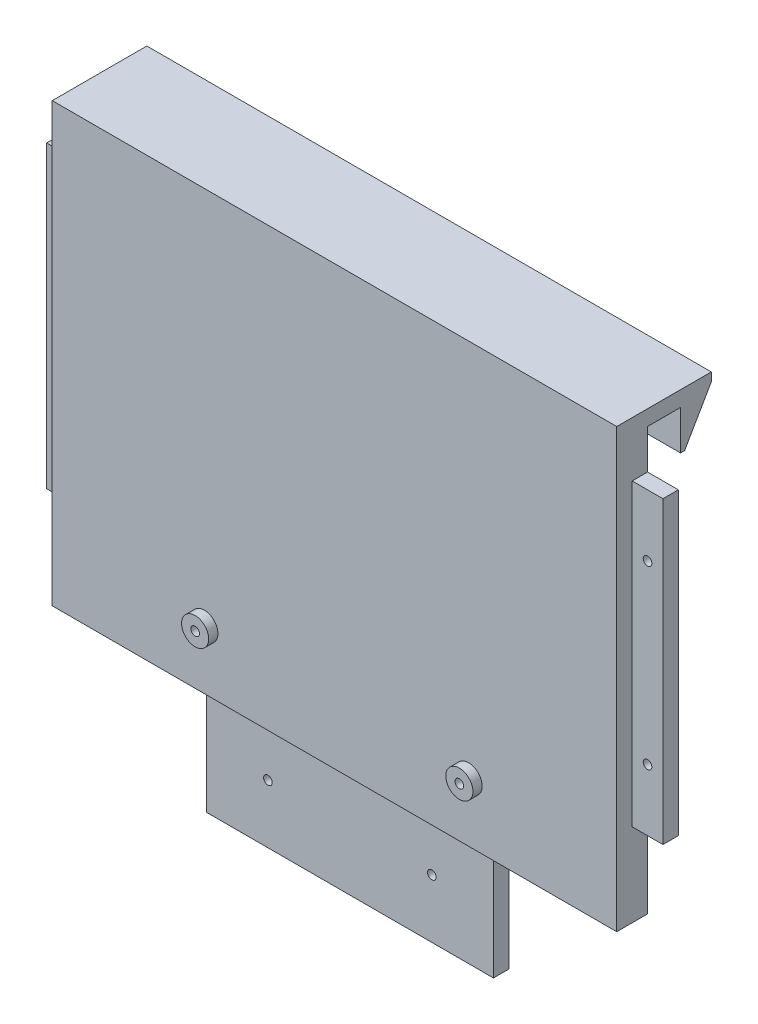
ISO-10303-21;
HEADER;
FILE_DESCRIPTION(('STEP AP214'),'2;1');
FILE_NAME('part.step','',(''),(''),'','','');
FILE_SCHEMA(('AUTOMOTIVE_DESIGN { 1 0 10303 214 1 1 1 1 }'));
ENDSEC;
DATA;
#1=APPLICATION_CONTEXT('core data for automotive mechanical design processes');
#2=APPLICATION_PROTOCOL_DEFINITION('international standard','automotive_design',2000,#1);
#3=PRODUCT_CONTEXT('',#1,'mechanical');
#4=PRODUCT('Part','Part','',(#3));
#5=PRODUCT_RELATED_PRODUCT_CATEGORY('part','',(#4));
#6=PRODUCT_DEFINITION_FORMATION('','',#4);
#7=PRODUCT_DEFINITION_CONTEXT('part definition',#1,'design');
#8=PRODUCT_DEFINITION('design','',#6,#7);
#9=PRODUCT_DEFINITION_SHAPE('','',#8);
#10=(LENGTH_UNIT() NAMED_UNIT(*) SI_UNIT(.MILLI.,.METRE.));
#11=(NAMED_UNIT(*) PLANE_ANGLE_UNIT() SI_UNIT($,.RADIAN.));
#12=(NAMED_UNIT(*) SI_UNIT($,.STERADIAN.) SOLID_ANGLE_UNIT());
#13=UNCERTAINTY_MEASURE_WITH_UNIT(LENGTH_MEASURE(1.E-05),#10,'distance_accuracy_value','');
#14=(GEOMETRIC_REPRESENTATION_CONTEXT(3) GLOBAL_UNCERTAINTY_ASSIGNED_CONTEXT((#13)) GLOBAL_UNIT_ASSIGNED_CONTEXT((#10,
#11,#12)) REPRESENTATION_CONTEXT('',''));
#15=CARTESIAN_POINT('',(0.,0.,0.));
#16=DIRECTION('',(0.,0.,1.));
#17=DIRECTION('',(1.,0.,0.));
#18=AXIS2_PLACEMENT_3D('',#15,#16,#17);
#19=CARTESIAN_POINT('',(0.,0.,30.7));
#20=DIRECTION('',(0.,1.,0.));
#21=DIRECTION('',(0.,0.,1.));
#22=AXIS2_PLACEMENT_3D('',#19,#20,#21);
#23=PLANE('',#22);
#24=DIRECTION('',(1.,0.,0.));
#25=VECTOR('',#24,1.);
#26=CARTESIAN_POINT('',(145.,0.,25.7));
#27=LINE('',#26,#25);
#28=CARTESIAN_POINT('',(51.8000000000001,0.,25.7));
#29=VERTEX_POINT('',#28);
#30=CARTESIAN_POINT('',(145.,0.,25.7));
#31=VERTEX_POINT('',#30);
#32=EDGE_CURVE('E363',#29,#31,#27,.T.);
#33=ORIENTED_EDGE('',*,*,#32,.F.);
#34=DIRECTION('',(0.,0.,1.));
#35=VECTOR('',#34,1.);
#36=CARTESIAN_POINT('',(51.8000000000001,0.,0.));
#37=LINE('',#36,#35);
#38=CARTESIAN_POINT('',(51.8000000000001,0.,20.7));
#39=VERTEX_POINT('',#38);
#40=EDGE_CURVE('E222',#39,#29,#37,.T.);
#41=ORIENTED_EDGE('',*,*,#40,.F.);
#42=DIRECTION('',(-1.,0.,0.));
#43=VECTOR('',#42,1.);
#44=CARTESIAN_POINT('',(180.,0.,20.7));
#45=LINE('',#44,#43);
#46=CARTESIAN_POINT('',(145.,0.,20.7));
#47=VERTEX_POINT('',#46);
#48=EDGE_CURVE('E246',#47,#39,#45,.T.);
#49=ORIENTED_EDGE('',*,*,#48,.F.);
#50=DIRECTION('',(0.,0.,1.));
#51=VECTOR('',#50,1.);
#52=CARTESIAN_POINT('',(145.,0.,0.));
#53=LINE('',#52,#51);
#54=EDGE_CURVE('E224',#47,#31,#53,.T.);
#55=ORIENTED_EDGE('',*,*,#54,.T.);
#56=EDGE_LOOP('',(#33,#41,#49,#55));
#57=FACE_BOUND('',#56,.T.);
#58=ADVANCED_FACE('F39',(#57),#23,.F.);
#59=CARTESIAN_POINT('',(200.,0.,0.));
#60=DIRECTION('',(1.,0.,0.));
#61=DIRECTION('',(0.,0.,-1.));
#62=AXIS2_PLACEMENT_3D('',#59,#60,#61);
#63=PLANE('',#62);
#64=DIRECTION('',(0.,0.,-1.));
#65=VECTOR('',#64,1.);
#66=CARTESIAN_POINT('',(200.,162.21,0.));
#67=LINE('',#66,#65);
#68=CARTESIAN_POINT('',(200.,162.21,25.7));
#69=VERTEX_POINT('',#68);
#70=CARTESIAN_POINT('',(200.,162.21,20.7));
#71=VERTEX_POINT('',#70);
#72=EDGE_CURVE('E264',#69,#71,#67,.T.);
#73=ORIENTED_EDGE('',*,*,#72,.F.);
#74=DIRECTION('',(0.,1.,0.));
#75=VECTOR('',#74,1.);
#76=CARTESIAN_POINT('',(200.,65.,25.7));
#77=LINE('',#76,#75);
#78=CARTESIAN_POINT('',(200.,65.,25.7));
#79=VERTEX_POINT('',#78);
#80=EDGE_CURVE('E367',#79,#69,#77,.T.);
#81=ORIENTED_EDGE('',*,*,#80,.F.);
#82=DIRECTION('',(0.,0.,1.));
#83=VECTOR('',#82,1.);
#84=CARTESIAN_POINT('',(200.,65.,0.));
#85=LINE('',#84,#83);
#86=CARTESIAN_POINT('',(200.,65.,20.7));
#87=VERTEX_POINT('',#86);
#88=EDGE_CURVE('E259',#87,#79,#85,.T.);
#89=ORIENTED_EDGE('',*,*,#88,.F.);
#90=DIRECTION('',(0.,1.,0.));
#91=VECTOR('',#90,1.);
#92=CARTESIAN_POINT('',(200.,0.,20.7));
#93=LINE('',#92,#91);
#94=EDGE_CURVE('E239',#87,#71,#93,.T.);
#95=ORIENTED_EDGE('',*,*,#94,.T.);
#96=EDGE_LOOP('',(#73,#81,#89,#95));
#97=FACE_BOUND('',#96,.T.);
#98=ADVANCED_FACE('F434',(#97),#63,.T.);
#99=CARTESIAN_POINT('',(145.,0.,0.));
#100=DIRECTION('',(-1.,0.,0.));
#101=DIRECTION('',(0.,0.,1.));
#102=AXIS2_PLACEMENT_3D('',#99,#100,#101);
#103=PLANE('',#102);
#104=DIRECTION('',(0.,1.,0.));
#105=VECTOR('',#104,1.);
#106=CARTESIAN_POINT('',(145.,0.,25.7));
#107=LINE('',#106,#105);
#108=CARTESIAN_POINT('',(145.,38.,25.7));
#109=VERTEX_POINT('',#108);
#110=EDGE_CURVE('E412',#31,#109,#107,.T.);
#111=ORIENTED_EDGE('',*,*,#110,.F.);
#112=ORIENTED_EDGE('',*,*,#54,.F.);
#113=DIRECTION('',(0.,1.,0.));
#114=VECTOR('',#113,1.);
#115=CARTESIAN_POINT('',(145.,0.,20.7));
#116=LINE('',#115,#114);
#117=CARTESIAN_POINT('',(145.,38.,20.7));
#118=VERTEX_POINT('',#117);
#119=EDGE_CURVE('E285',#47,#118,#116,.T.);
#120=ORIENTED_EDGE('',*,*,#119,.T.);
#121=DIRECTION('',(0.,0.,1.));
#122=VECTOR('',#121,1.);
#123=CARTESIAN_POINT('',(145.,38.,0.));
#124=LINE('',#123,#122);
#125=EDGE_CURVE('E380',#118,#109,#124,.T.);
#126=ORIENTED_EDGE('',*,*,#125,.T.);
#127=EDGE_LOOP('',(#111,#112,#120,#126));
#128=FACE_BOUND('',#127,.T.);
#129=ADVANCED_FACE('F470',(#128),#103,.F.);
#130=CARTESIAN_POINT('',(200.,65.,0.));
#131=DIRECTION('',(0.,1.,0.));
#132=DIRECTION('',(0.,0.,1.));
#133=AXIS2_PLACEMENT_3D('',#130,#131,#132);
#134=PLANE('',#133);
#135=DIRECTION('',(1.,0.,0.));
#136=VECTOR('',#135,1.);
#137=CARTESIAN_POINT('',(200.,65.,25.7));
#138=LINE('',#137,#136);
#139=CARTESIAN_POINT('',(190.,65.,25.7));
#140=VERTEX_POINT('',#139);
#141=EDGE_CURVE('E192',#140,#79,#138,.T.);
#142=ORIENTED_EDGE('',*,*,#141,.F.);
#143=DIRECTION('',(0.,0.,1.));
#144=VECTOR('',#143,1.);
#145=CARTESIAN_POINT('',(190.,65.,0.));
#146=LINE('',#145,#144);
#147=CARTESIAN_POINT('',(190.,65.,20.7));
#148=VERTEX_POINT('',#147);
#149=EDGE_CURVE('E377',#148,#140,#146,.T.);
#150=ORIENTED_EDGE('',*,*,#149,.F.);
#151=DIRECTION('',(1.,0.,0.));
#152=VECTOR('',#151,1.);
#153=CARTESIAN_POINT('',(0.,65.,20.7));
#154=LINE('',#153,#152);
#155=EDGE_CURVE('E207',#148,#87,#154,.T.);
#156=ORIENTED_EDGE('',*,*,#155,.T.);
#157=ORIENTED_EDGE('',*,*,#88,.T.);
#158=EDGE_LOOP('',(#142,#150,#156,#157));
#159=FACE_BOUND('',#158,.T.);
#160=ADVANCED_FACE('F426',(#159),#134,.F.);
#161=CARTESIAN_POINT('',(200.,162.21,0.));
#162=DIRECTION('',(0.,-1.,0.));
#163=DIRECTION('',(0.,0.,-1.));
#164=AXIS2_PLACEMENT_3D('',#161,#162,#163);
#165=PLANE('',#164);
#166=DIRECTION('',(-1.,0.,0.));
#167=VECTOR('',#166,1.);
#168=CARTESIAN_POINT('',(200.,162.21,25.7));
#169=LINE('',#168,#167);
#170=CARTESIAN_POINT('',(190.,162.21,25.7));
#171=VERTEX_POINT('',#170);
#172=EDGE_CURVE('E370',#69,#171,#169,.T.);
#173=ORIENTED_EDGE('',*,*,#172,.F.);
#174=ORIENTED_EDGE('',*,*,#72,.T.);
#175=DIRECTION('',(-1.,0.,0.));
#176=VECTOR('',#175,1.);
#177=CARTESIAN_POINT('',(0.,162.21,20.7));
#178=LINE('',#177,#176);
#179=CARTESIAN_POINT('',(190.,162.21,20.7));
#180=VERTEX_POINT('',#179);
#181=EDGE_CURVE('E209',#71,#180,#178,.T.);
#182=ORIENTED_EDGE('',*,*,#181,.T.);
#183=DIRECTION('',(0.,0.,1.));
#184=VECTOR('',#183,1.);
#185=CARTESIAN_POINT('',(190.,162.21,0.));
#186=LINE('',#185,#184);
#187=EDGE_CURVE('E394',#180,#171,#186,.T.);
#188=ORIENTED_EDGE('',*,*,#187,.T.);
#189=EDGE_LOOP('',(#173,#174,#182,#188));
#190=FACE_BOUND('',#189,.T.);
#191=ADVANCED_FACE('F437',(#190),#165,.F.);
#192=CARTESIAN_POINT('',(51.8000000000001,0.,0.));
#193=DIRECTION('',(1.,0.,0.));
#194=DIRECTION('',(0.,0.,-1.));
#195=AXIS2_PLACEMENT_3D('',#192,#193,#194);
#196=PLANE('',#195);
#197=DIRECTION('',(0.,-1.,0.));
#198=VECTOR('',#197,1.);
#199=CARTESIAN_POINT('',(51.8000000000001,0.,25.7));
#200=LINE('',#199,#198);
#201=CARTESIAN_POINT('',(51.8000000000001,38.,25.7));
#202=VERTEX_POINT('',#201);
#203=EDGE_CURVE('E368',#202,#29,#200,.T.);
#204=ORIENTED_EDGE('',*,*,#203,.F.);
#205=DIRECTION('',(0.,0.,1.));
#206=VECTOR('',#205,1.);
#207=CARTESIAN_POINT('',(51.8000000000001,38.,0.));
#208=LINE('',#207,#206);
#209=CARTESIAN_POINT('',(51.8000000000001,38.,20.7));
#210=VERTEX_POINT('',#209);
#211=EDGE_CURVE('E219',#210,#202,#208,.T.);
#212=ORIENTED_EDGE('',*,*,#211,.F.);
#213=DIRECTION('',(0.,-1.,0.));
#214=VECTOR('',#213,1.);
#215=CARTESIAN_POINT('',(51.8000000000001,0.,20.7));
#216=LINE('',#215,#214);
#217=EDGE_CURVE('E272',#210,#39,#216,.T.);
#218=ORIENTED_EDGE('',*,*,#217,.T.);
#219=ORIENTED_EDGE('',*,*,#40,.T.);
#220=EDGE_LOOP('',(#204,#212,#218,#219));
#221=FACE_BOUND('',#220,.T.);
#222=ADVANCED_FACE('F359',(#221),#196,.F.);
#223=CARTESIAN_POINT('',(0.,0.,30.7));
#224=DIRECTION('',(1.,0.,0.));
#225=DIRECTION('',(0.,0.,-1.));
#226=AXIS2_PLACEMENT_3D('',#223,#224,#225);
#227=PLANE('',#226);
#228=DIRECTION('',(0.,0.,1.));
#229=VECTOR('',#228,1.);
#230=CARTESIAN_POINT('',(0.,65.,0.));
#231=LINE('',#230,#229);
#232=CARTESIAN_POINT('',(0.,65.,20.7));
#233=VERTEX_POINT('',#232);
#234=CARTESIAN_POINT('',(0.,65.,25.7));
#235=VERTEX_POINT('',#234);
#236=EDGE_CURVE('E197',#233,#235,#231,.T.);
#237=ORIENTED_EDGE('',*,*,#236,.T.);
#238=DIRECTION('',(0.,-1.,0.));
#239=VECTOR('',#238,1.);
#240=CARTESIAN_POINT('',(0.,65.,25.7));
#241=LINE('',#240,#239);
#242=CARTESIAN_POINT('',(0.,162.21,25.7));
#243=VERTEX_POINT('',#242);
#244=EDGE_CURVE('E181',#243,#235,#241,.T.);
#245=ORIENTED_EDGE('',*,*,#244,.F.);
#246=DIRECTION('',(0.,0.,1.));
#247=VECTOR('',#246,1.);
#248=CARTESIAN_POINT('',(0.,162.21,0.));
#249=LINE('',#248,#247);
#250=CARTESIAN_POINT('',(0.,162.21,20.7));
#251=VERTEX_POINT('',#250);
#252=EDGE_CURVE('E214',#251,#243,#249,.T.);
#253=ORIENTED_EDGE('',*,*,#252,.F.);
#254=DIRECTION('',(0.,1.,0.));
#255=VECTOR('',#254,1.);
#256=CARTESIAN_POINT('',(0.,162.21,20.7));
#257=LINE('',#256,#255);
#258=EDGE_CURVE('E206',#233,#251,#257,.T.);
#259=ORIENTED_EDGE('',*,*,#258,.F.);
#260=EDGE_LOOP('',(#237,#245,#253,#259));
#261=FACE_BOUND('',#260,.T.);
#262=ADVANCED_FACE('F204',(#261),#227,.F.);
#263=CARTESIAN_POINT('',(0.,180.,30.7));
#264=DIRECTION('',(0.,-1.,0.));
#265=DIRECTION('',(0.,0.,-1.));
#266=AXIS2_PLACEMENT_3D('',#263,#264,#265);
#267=PLANE('',#266);
#268=DIRECTION('',(-1.,0.,0.));
#269=VECTOR('',#268,1.);
#270=CARTESIAN_POINT('',(0.,180.,0.));
#271=LINE('',#270,#269);
#272=CARTESIAN_POINT('',(190.,180.,0.));
#273=VERTEX_POINT('',#272);
#274=CARTESIAN_POINT('',(6.79999999999997,180.,0.));
#275=VERTEX_POINT('',#274);
#276=EDGE_CURVE('E255',#273,#275,#271,.T.);
#277=ORIENTED_EDGE('',*,*,#276,.T.);
#278=DIRECTION('',(0.,0.,1.));
#279=VECTOR('',#278,1.);
#280=CARTESIAN_POINT('',(6.79999999999997,180.,0.));
#281=LINE('',#280,#279);
#282=CARTESIAN_POINT('',(6.79999999999997,180.,30.7));
#283=VERTEX_POINT('',#282);
#284=EDGE_CURVE('E392',#275,#283,#281,.T.);
#285=ORIENTED_EDGE('',*,*,#284,.T.);
#286=DIRECTION('',(-1.,0.,0.));
#287=VECTOR('',#286,1.);
#288=CARTESIAN_POINT('',(0.,180.,30.7));
#289=LINE('',#288,#287);
#290=CARTESIAN_POINT('',(190.,180.,30.7));
#291=VERTEX_POINT('',#290);
#292=EDGE_CURVE('E256',#291,#283,#289,.T.);
#293=ORIENTED_EDGE('',*,*,#292,.F.);
#294=DIRECTION('',(0.,0.,1.));
#295=VECTOR('',#294,1.);
#296=CARTESIAN_POINT('',(190.,180.,0.));
#297=LINE('',#296,#295);
#298=EDGE_CURVE('E389',#273,#291,#297,.T.);
#299=ORIENTED_EDGE('',*,*,#298,.F.);
#300=EDGE_LOOP('',(#277,#285,#293,#299));
#301=FACE_BOUND('',#300,.T.);
#302=ADVANCED_FACE('F327',(#301),#267,.F.);
#303=CARTESIAN_POINT('',(0.,0.,30.7));
#304=DIRECTION('',(0.,0.,-1.));
#305=DIRECTION('',(-1.,0.,0.));
#306=AXIS2_PLACEMENT_3D('',#303,#304,#305);
#307=PLANE('',#306);
#308=CARTESIAN_POINT('',(141.93,57.07,30.7));
#309=DIRECTION('',(0.,0.,-1.));
#310=DIRECTION('',(-1.,0.,0.));
#311=AXIS2_PLACEMENT_3D('',#308,#309,#310);
#312=CIRCLE('',#311,4.40000000000003);
#313=CARTESIAN_POINT('',(137.53,57.07,30.7));
#314=VERTEX_POINT('',#313);
#315=EDGE_CURVE('E11',#314,#314,#312,.F.);
#316=ORIENTED_EDGE('',*,*,#315,.F.);
#317=EDGE_LOOP('',(#316));
#318=FACE_BOUND('',#317,.T.);
#319=CARTESIAN_POINT('',(56.17,57.07,30.7));
#320=DIRECTION('',(0.,0.,-1.));
#321=DIRECTION('',(-1.,0.,0.));
#322=AXIS2_PLACEMENT_3D('',#319,#320,#321);
#323=CIRCLE('',#322,4.4);
#324=CARTESIAN_POINT('',(51.77,57.07,30.7));
#325=VERTEX_POINT('',#324);
#326=EDGE_CURVE('E47',#325,#325,#323,.F.);
#327=ORIENTED_EDGE('',*,*,#326,.F.);
#328=EDGE_LOOP('',(#327));
#329=FACE_BOUND('',#328,.T.);
#330=DIRECTION('',(0.,1.,0.));
#331=VECTOR('',#330,1.);
#332=CARTESIAN_POINT('',(6.79999999999997,162.21,30.7));
#333=LINE('',#332,#331);
#334=CARTESIAN_POINT('',(6.80000000000008,38.,30.7));
#335=VERTEX_POINT('',#334);
#336=EDGE_CURVE('E334',#335,#283,#333,.T.);
#337=ORIENTED_EDGE('',*,*,#336,.F.);
#338=DIRECTION('',(-1.,0.,0.));
#339=VECTOR('',#338,1.);
#340=CARTESIAN_POINT('',(190.,38.,30.7));
#341=LINE('',#340,#339);
#342=CARTESIAN_POINT('',(190.,38.,30.7));
#343=VERTEX_POINT('',#342);
#344=EDGE_CURVE('E336',#343,#335,#341,.T.);
#345=ORIENTED_EDGE('',*,*,#344,.F.);
#346=DIRECTION('',(0.,-1.,0.));
#347=VECTOR('',#346,1.);
#348=CARTESIAN_POINT('',(190.,162.21,30.7));
#349=LINE('',#348,#347);
#350=EDGE_CURVE('E390',#291,#343,#349,.T.);
#351=ORIENTED_EDGE('',*,*,#350,.F.);
#352=ORIENTED_EDGE('',*,*,#292,.T.);
#353=EDGE_LOOP('',(#337,#345,#351,#352));
#354=FACE_BOUND('',#353,.T.);
#355=ADVANCED_FACE('F323',(#318,#329,#354),#307,.F.);
#356=CARTESIAN_POINT('',(0.,0.,0.));
#357=DIRECTION('',(0.,0.,-1.));
#358=DIRECTION('',(-1.,0.,0.));
#359=AXIS2_PLACEMENT_3D('',#356,#357,#358);
#360=PLANE('',#359);
#361=DIRECTION('',(0.,-1.,0.));
#362=VECTOR('',#361,1.);
#363=CARTESIAN_POINT('',(190.,162.21,0.));
#364=LINE('',#363,#362);
#365=CARTESIAN_POINT('',(190.,177.21,0.));
#366=VERTEX_POINT('',#365);
#367=EDGE_CURVE('E387',#273,#366,#364,.T.);
#368=ORIENTED_EDGE('',*,*,#367,.T.);
#369=DIRECTION('',(-1.,0.,0.));
#370=VECTOR('',#369,1.);
#371=CARTESIAN_POINT('',(6.79999999999997,177.21,0.));
#372=LINE('',#371,#370);
#373=CARTESIAN_POINT('',(6.79999999999997,177.21,0.));
#374=VERTEX_POINT('',#373);
#375=EDGE_CURVE('E54',#366,#374,#372,.T.);
#376=ORIENTED_EDGE('',*,*,#375,.T.);
#377=DIRECTION('',(0.,1.,0.));
#378=VECTOR('',#377,1.);
#379=CARTESIAN_POINT('',(6.79999999999997,162.21,0.));
#380=LINE('',#379,#378);
#381=EDGE_CURVE('E341',#374,#275,#380,.T.);
#382=ORIENTED_EDGE('',*,*,#381,.T.);
#383=ORIENTED_EDGE('',*,*,#276,.F.);
#384=EDGE_LOOP('',(#368,#376,#382,#383));
#385=FACE_BOUND('',#384,.T.);
#386=ADVANCED_FACE('F326',(#385),#360,.T.);
#387=CARTESIAN_POINT('',(180.,162.21,20.7));
#388=DIRECTION('',(0.,1.,0.));
#389=DIRECTION('',(0.,0.,1.));
#390=AXIS2_PLACEMENT_3D('',#387,#388,#389);
#391=PLANE('',#390);
#392=DIRECTION('',(0.,0.,1.));
#393=VECTOR('',#392,1.);
#394=CARTESIAN_POINT('',(6.79999999999997,162.21,0.));
#395=LINE('',#394,#393);
#396=CARTESIAN_POINT('',(6.79999999999997,162.21,8.6602540378444));
#397=VERTEX_POINT('',#396);
#398=CARTESIAN_POINT('',(6.79999999999997,162.21,10.));
#399=VERTEX_POINT('',#398);
#400=EDGE_CURVE('E397',#397,#399,#395,.T.);
#401=ORIENTED_EDGE('',*,*,#400,.F.);
#402=DIRECTION('',(1.,0.,0.));
#403=VECTOR('',#402,1.);
#404=CARTESIAN_POINT('',(190.,162.21,8.6602540378444));
#405=LINE('',#404,#403);
#406=CARTESIAN_POINT('',(190.,162.21,8.6602540378444));
#407=VERTEX_POINT('',#406);
#408=EDGE_CURVE('E287',#397,#407,#405,.T.);
#409=ORIENTED_EDGE('',*,*,#408,.T.);
#410=CARTESIAN_POINT('',(190.,162.21,10.));
#411=VERTEX_POINT('',#410);
#412=EDGE_CURVE('E378',#407,#411,#186,.T.);
#413=ORIENTED_EDGE('',*,*,#412,.T.);
#414=DIRECTION('',(-1.,0.,0.));
#415=VECTOR('',#414,1.);
#416=CARTESIAN_POINT('',(274.7,162.21,10.));
#417=LINE('',#416,#415);
#418=EDGE_CURVE('E243',#411,#399,#417,.T.);
#419=ORIENTED_EDGE('',*,*,#418,.T.);
#420=EDGE_LOOP('',(#401,#409,#413,#419));
#421=FACE_BOUND('',#420,.T.);
#422=ADVANCED_FACE('F450',(#421),#391,.F.);
#423=CARTESIAN_POINT('',(0.,0.,20.7));
#424=DIRECTION('',(0.,0.,-1.));
#425=DIRECTION('',(-1.,0.,0.));
#426=AXIS2_PLACEMENT_3D('',#423,#424,#425);
#427=PLANE('',#426);
#428=CARTESIAN_POINT('',(71.8000000000001,19.,20.7));
#429=DIRECTION('',(0.,0.,-1.));
#430=DIRECTION('',(-1.,0.,0.));
#431=AXIS2_PLACEMENT_3D('',#428,#429,#430);
#432=CIRCLE('',#431,1.4);
#433=CARTESIAN_POINT('',(70.4000000000001,19.,20.7));
#434=VERTEX_POINT('',#433);
#435=EDGE_CURVE('E317',#434,#434,#432,.T.);
#436=ORIENTED_EDGE('',*,*,#435,.F.);
#437=EDGE_LOOP('',(#436));
#438=FACE_BOUND('',#437,.T.);
#439=CARTESIAN_POINT('',(195.,85.,20.7));
#440=DIRECTION('',(0.,0.,-1.));
#441=DIRECTION('',(-1.,0.,0.));
#442=AXIS2_PLACEMENT_3D('',#439,#440,#441);
#443=CIRCLE('',#442,1.4);
#444=CARTESIAN_POINT('',(193.6,85.,20.7));
#445=VERTEX_POINT('',#444);
#446=EDGE_CURVE('E302',#445,#445,#443,.T.);
#447=ORIENTED_EDGE('',*,*,#446,.F.);
#448=EDGE_LOOP('',(#447));
#449=FACE_BOUND('',#448,.T.);
#450=CARTESIAN_POINT('',(195.,142.21,20.7));
#451=DIRECTION('',(0.,0.,-1.));
#452=DIRECTION('',(-1.,0.,0.));
#453=AXIS2_PLACEMENT_3D('',#450,#451,#452);
#454=CIRCLE('',#453,1.40000000000001);
#455=CARTESIAN_POINT('',(193.6,142.21,20.7));
#456=VERTEX_POINT('',#455);
#457=EDGE_CURVE('E297',#456,#456,#454,.T.);
#458=ORIENTED_EDGE('',*,*,#457,.F.);
#459=EDGE_LOOP('',(#458));
#460=FACE_BOUND('',#459,.T.);
#461=CARTESIAN_POINT('',(3.40000000000004,142.21,20.7));
#462=DIRECTION('',(0.,0.,-1.));
#463=DIRECTION('',(-1.,0.,0.));
#464=AXIS2_PLACEMENT_3D('',#461,#462,#463);
#465=CIRCLE('',#464,1.40000000000001);
#466=CARTESIAN_POINT('',(2.00000000000003,142.21,20.7));
#467=VERTEX_POINT('',#466);
#468=EDGE_CURVE('E310',#467,#467,#465,.T.);
#469=ORIENTED_EDGE('',*,*,#468,.F.);
#470=EDGE_LOOP('',(#469));
#471=FACE_BOUND('',#470,.T.);
#472=CARTESIAN_POINT('',(3.40000000000004,85.,20.7));
#473=DIRECTION('',(0.,0.,-1.));
#474=DIRECTION('',(-1.,0.,0.));
#475=AXIS2_PLACEMENT_3D('',#472,#473,#474);
#476=CIRCLE('',#475,1.4);
#477=CARTESIAN_POINT('',(2.00000000000004,85.,20.7));
#478=VERTEX_POINT('',#477);
#479=EDGE_CURVE('E306',#478,#478,#476,.T.);
#480=ORIENTED_EDGE('',*,*,#479,.F.);
#481=EDGE_LOOP('',(#480));
#482=FACE_BOUND('',#481,.T.);
#483=CARTESIAN_POINT('',(125.,19.,20.7));
#484=DIRECTION('',(0.,0.,-1.));
#485=DIRECTION('',(-1.,0.,0.));
#486=AXIS2_PLACEMENT_3D('',#483,#484,#485);
#487=CIRCLE('',#486,1.4);
#488=CARTESIAN_POINT('',(123.6,19.,20.7));
#489=VERTEX_POINT('',#488);
#490=EDGE_CURVE('E314',#489,#489,#487,.T.);
#491=ORIENTED_EDGE('',*,*,#490,.F.);
#492=EDGE_LOOP('',(#491));
#493=FACE_BOUND('',#492,.T.);
#494=DIRECTION('',(0.,-1.,0.));
#495=VECTOR('',#494,1.);
#496=CARTESIAN_POINT('',(6.79999999999997,0.,20.7));
#497=LINE('',#496,#495);
#498=CARTESIAN_POINT('',(6.79999999999997,175.,20.7));
#499=VERTEX_POINT('',#498);
#500=CARTESIAN_POINT('',(6.79999999999997,162.21,20.7));
#501=VERTEX_POINT('',#500);
#502=EDGE_CURVE('E237',#499,#501,#497,.T.);
#503=ORIENTED_EDGE('',*,*,#502,.F.);
#504=DIRECTION('',(-1.,0.,0.));
#505=VECTOR('',#504,1.);
#506=CARTESIAN_POINT('',(274.7,175.,20.7));
#507=LINE('',#506,#505);
#508=CARTESIAN_POINT('',(190.,175.,20.7));
#509=VERTEX_POINT('',#508);
#510=EDGE_CURVE('E242',#509,#499,#507,.T.);
#511=ORIENTED_EDGE('',*,*,#510,.F.);
#512=DIRECTION('',(0.,1.,0.));
#513=VECTOR('',#512,1.);
#514=CARTESIAN_POINT('',(190.,0.,20.7));
#515=LINE('',#514,#513);
#516=EDGE_CURVE('E230',#180,#509,#515,.T.);
#517=ORIENTED_EDGE('',*,*,#516,.F.);
#518=ORIENTED_EDGE('',*,*,#181,.F.);
#519=ORIENTED_EDGE('',*,*,#94,.F.);
#520=ORIENTED_EDGE('',*,*,#155,.F.);
#521=DIRECTION('',(0.,1.,0.));
#522=VECTOR('',#521,1.);
#523=CARTESIAN_POINT('',(190.,0.,20.7));
#524=LINE('',#523,#522);
#525=CARTESIAN_POINT('',(190.,38.,20.7));
#526=VERTEX_POINT('',#525);
#527=EDGE_CURVE('E281',#526,#148,#524,.T.);
#528=ORIENTED_EDGE('',*,*,#527,.F.);
#529=DIRECTION('',(1.,0.,0.));
#530=VECTOR('',#529,1.);
#531=CARTESIAN_POINT('',(0.,38.,20.7));
#532=LINE('',#531,#530);
#533=EDGE_CURVE('E283',#118,#526,#532,.T.);
#534=ORIENTED_EDGE('',*,*,#533,.F.);
#535=ORIENTED_EDGE('',*,*,#119,.F.);
#536=ORIENTED_EDGE('',*,*,#48,.T.);
#537=ORIENTED_EDGE('',*,*,#217,.F.);
#538=DIRECTION('',(1.,0.,0.));
#539=VECTOR('',#538,1.);
#540=CARTESIAN_POINT('',(0.,38.,20.7));
#541=LINE('',#540,#539);
#542=CARTESIAN_POINT('',(6.80000000000008,38.,20.7));
#543=VERTEX_POINT('',#542);
#544=EDGE_CURVE('E274',#543,#210,#541,.T.);
#545=ORIENTED_EDGE('',*,*,#544,.F.);
#546=DIRECTION('',(0.,-1.,0.));
#547=VECTOR('',#546,1.);
#548=CARTESIAN_POINT('',(6.80000000000008,0.,20.7));
#549=LINE('',#548,#547);
#550=CARTESIAN_POINT('',(6.80000000000008,65.,20.7));
#551=VERTEX_POINT('',#550);
#552=EDGE_CURVE('E277',#551,#543,#549,.T.);
#553=ORIENTED_EDGE('',*,*,#552,.F.);
#554=DIRECTION('',(1.,0.,0.));
#555=VECTOR('',#554,1.);
#556=CARTESIAN_POINT('',(0.,65.,20.7));
#557=LINE('',#556,#555);
#558=EDGE_CURVE('E279',#233,#551,#557,.T.);
#559=ORIENTED_EDGE('',*,*,#558,.F.);
#560=ORIENTED_EDGE('',*,*,#258,.T.);
#561=DIRECTION('',(-1.,0.,0.));
#562=VECTOR('',#561,1.);
#563=CARTESIAN_POINT('',(0.,162.21,20.7));
#564=LINE('',#563,#562);
#565=EDGE_CURVE('E232',#501,#251,#564,.T.);
#566=ORIENTED_EDGE('',*,*,#565,.F.);
#567=EDGE_LOOP('',(#503,#511,#517,#518,#519,#520,#528,#534,#535,#536,#537,#545,#553,#559,#560,#566));
#568=FACE_BOUND('',#567,.T.);
#569=ADVANCED_FACE('F353',(#438,#449,#460,#471,#482,#493,#568),#427,.T.);
#570=CARTESIAN_POINT('',(274.7,175.,20.7));
#571=DIRECTION('',(0.,1.,0.));
#572=DIRECTION('',(0.,0.,1.));
#573=AXIS2_PLACEMENT_3D('',#570,#571,#572);
#574=PLANE('',#573);
#575=ORIENTED_EDGE('',*,*,#510,.T.);
#576=DIRECTION('',(0.,0.,-1.));
#577=VECTOR('',#576,1.);
#578=CARTESIAN_POINT('',(6.79999999999997,175.,20.7));
#579=LINE('',#578,#577);
#580=CARTESIAN_POINT('',(6.79999999999997,175.,10.));
#581=VERTEX_POINT('',#580);
#582=EDGE_CURVE('E234',#499,#581,#579,.T.);
#583=ORIENTED_EDGE('',*,*,#582,.T.);
#584=DIRECTION('',(-1.,0.,0.));
#585=VECTOR('',#584,1.);
#586=CARTESIAN_POINT('',(274.7,175.,10.));
#587=LINE('',#586,#585);
#588=CARTESIAN_POINT('',(190.,175.,10.));
#589=VERTEX_POINT('',#588);
#590=EDGE_CURVE('E247',#589,#581,#587,.T.);
#591=ORIENTED_EDGE('',*,*,#590,.F.);
#592=DIRECTION('',(0.,0.,1.));
#593=VECTOR('',#592,1.);
#594=CARTESIAN_POINT('',(190.,175.,20.7));
#595=LINE('',#594,#593);
#596=EDGE_CURVE('E227',#589,#509,#595,.T.);
#597=ORIENTED_EDGE('',*,*,#596,.T.);
#598=EDGE_LOOP('',(#575,#583,#591,#597));
#599=FACE_BOUND('',#598,.T.);
#600=ADVANCED_FACE('F445',(#599),#574,.F.);
#601=CARTESIAN_POINT('',(274.7,162.21,10.));
#602=DIRECTION('',(0.,0.,-1.));
#603=DIRECTION('',(-1.,0.,0.));
#604=AXIS2_PLACEMENT_3D('',#601,#602,#603);
#605=PLANE('',#604);
#606=ORIENTED_EDGE('',*,*,#590,.T.);
#607=DIRECTION('',(0.,-1.,0.));
#608=VECTOR('',#607,1.);
#609=CARTESIAN_POINT('',(6.79999999999997,162.21,10.));
#610=LINE('',#609,#608);
#611=EDGE_CURVE('E269',#581,#399,#610,.T.);
#612=ORIENTED_EDGE('',*,*,#611,.T.);
#613=ORIENTED_EDGE('',*,*,#418,.F.);
#614=DIRECTION('',(0.,1.,0.));
#615=VECTOR('',#614,1.);
#616=CARTESIAN_POINT('',(190.,162.21,10.));
#617=LINE('',#616,#615);
#618=EDGE_CURVE('E266',#411,#589,#617,.T.);
#619=ORIENTED_EDGE('',*,*,#618,.T.);
#620=EDGE_LOOP('',(#606,#612,#613,#619));
#621=FACE_BOUND('',#620,.T.);
#622=ADVANCED_FACE('F447',(#621),#605,.F.);
#623=CARTESIAN_POINT('',(190.,38.,0.));
#624=DIRECTION('',(0.,1.,0.));
#625=DIRECTION('',(0.,0.,1.));
#626=AXIS2_PLACEMENT_3D('',#623,#624,#625);
#627=PLANE('',#626);
#628=ORIENTED_EDGE('',*,*,#533,.T.);
#629=DIRECTION('',(0.,0.,1.));
#630=VECTOR('',#629,1.);
#631=CARTESIAN_POINT('',(190.,38.,0.));
#632=LINE('',#631,#630);
#633=EDGE_CURVE('E383',#526,#343,#632,.T.);
#634=ORIENTED_EDGE('',*,*,#633,.T.);
#635=ORIENTED_EDGE('',*,*,#344,.T.);
#636=DIRECTION('',(0.,0.,1.));
#637=VECTOR('',#636,1.);
#638=CARTESIAN_POINT('',(6.80000000000008,38.,0.));
#639=LINE('',#638,#637);
#640=EDGE_CURVE('E211',#543,#335,#639,.T.);
#641=ORIENTED_EDGE('',*,*,#640,.F.);
#642=ORIENTED_EDGE('',*,*,#544,.T.);
#643=ORIENTED_EDGE('',*,*,#211,.T.);
#644=DIRECTION('',(-1.,0.,0.));
#645=VECTOR('',#644,1.);
#646=CARTESIAN_POINT('',(145.,38.,25.7));
#647=LINE('',#646,#645);
#648=EDGE_CURVE('E372',#109,#202,#647,.T.);
#649=ORIENTED_EDGE('',*,*,#648,.F.);
#650=ORIENTED_EDGE('',*,*,#125,.F.);
#651=EDGE_LOOP('',(#628,#634,#635,#641,#642,#643,#649,#650));
#652=FACE_BOUND('',#651,.T.);
#653=ADVANCED_FACE('F348',(#652),#627,.F.);
#654=CARTESIAN_POINT('',(190.,162.21,0.));
#655=DIRECTION('',(-1.,0.,0.));
#656=DIRECTION('',(0.,0.,1.));
#657=AXIS2_PLACEMENT_3D('',#654,#655,#656);
#658=PLANE('',#657);
#659=ORIENTED_EDGE('',*,*,#412,.F.);
#660=DIRECTION('',(0.,0.86602540378444,-0.499999999999998));
#661=VECTOR('',#660,1.);
#662=CARTESIAN_POINT('',(190.,162.21,8.6602540378444));
#663=LINE('',#662,#661);
#664=EDGE_CURVE('E62',#407,#366,#663,.T.);
#665=ORIENTED_EDGE('',*,*,#664,.T.);
#666=ORIENTED_EDGE('',*,*,#367,.F.);
#667=ORIENTED_EDGE('',*,*,#298,.T.);
#668=ORIENTED_EDGE('',*,*,#350,.T.);
#669=ORIENTED_EDGE('',*,*,#633,.F.);
#670=ORIENTED_EDGE('',*,*,#527,.T.);
#671=ORIENTED_EDGE('',*,*,#149,.T.);
#672=DIRECTION('',(0.,-1.,0.));
#673=VECTOR('',#672,1.);
#674=CARTESIAN_POINT('',(190.,65.,25.7));
#675=LINE('',#674,#673);
#676=EDGE_CURVE('E409',#171,#140,#675,.T.);
#677=ORIENTED_EDGE('',*,*,#676,.F.);
#678=ORIENTED_EDGE('',*,*,#187,.F.);
#679=ORIENTED_EDGE('',*,*,#516,.T.);
#680=ORIENTED_EDGE('',*,*,#596,.F.);
#681=ORIENTED_EDGE('',*,*,#618,.F.);
#682=EDGE_LOOP('',(#659,#665,#666,#667,#668,#669,#670,#671,#677,#678,#679,#680,#681));
#683=FACE_BOUND('',#682,.T.);
#684=ADVANCED_FACE('F422',(#683),#658,.F.);
#685=CARTESIAN_POINT('',(6.79999999999997,162.21,0.));
#686=DIRECTION('',(1.,0.,0.));
#687=DIRECTION('',(0.,0.,-1.));
#688=AXIS2_PLACEMENT_3D('',#685,#686,#687);
#689=PLANE('',#688);
#690=ORIENTED_EDGE('',*,*,#381,.F.);
#691=DIRECTION('',(0.,-0.86602540378444,0.499999999999998));
#692=VECTOR('',#691,1.);
#693=CARTESIAN_POINT('',(6.79999999999997,162.21,8.6602540378444));
#694=LINE('',#693,#692);
#695=EDGE_CURVE('E292',#374,#397,#694,.T.);
#696=ORIENTED_EDGE('',*,*,#695,.T.);
#697=ORIENTED_EDGE('',*,*,#400,.T.);
#698=ORIENTED_EDGE('',*,*,#611,.F.);
#699=ORIENTED_EDGE('',*,*,#582,.F.);
#700=ORIENTED_EDGE('',*,*,#502,.T.);
#701=CARTESIAN_POINT('',(6.79999999999997,162.21,25.7));
#702=VERTEX_POINT('',#701);
#703=EDGE_CURVE('E398',#501,#702,#395,.T.);
#704=ORIENTED_EDGE('',*,*,#703,.T.);
#705=DIRECTION('',(0.,1.,0.));
#706=VECTOR('',#705,1.);
#707=CARTESIAN_POINT('',(6.79999999999997,65.,25.7));
#708=LINE('',#707,#706);
#709=CARTESIAN_POINT('',(6.80000000000008,65.,25.7));
#710=VERTEX_POINT('',#709);
#711=EDGE_CURVE('E201',#710,#702,#708,.T.);
#712=ORIENTED_EDGE('',*,*,#711,.F.);
#713=DIRECTION('',(0.,0.,1.));
#714=VECTOR('',#713,1.);
#715=CARTESIAN_POINT('',(6.80000000000008,65.,0.));
#716=LINE('',#715,#714);
#717=EDGE_CURVE('E200',#551,#710,#716,.T.);
#718=ORIENTED_EDGE('',*,*,#717,.F.);
#719=ORIENTED_EDGE('',*,*,#552,.T.);
#720=ORIENTED_EDGE('',*,*,#640,.T.);
#721=ORIENTED_EDGE('',*,*,#336,.T.);
#722=ORIENTED_EDGE('',*,*,#284,.F.);
#723=EDGE_LOOP('',(#690,#696,#697,#698,#699,#700,#704,#712,#718,#719,#720,#721,#722));
#724=FACE_BOUND('',#723,.T.);
#725=ADVANCED_FACE('F344',(#724),#689,.F.);
#726=CARTESIAN_POINT('',(0.,162.21,0.));
#727=DIRECTION('',(0.,-1.,0.));
#728=DIRECTION('',(0.,0.,-1.));
#729=AXIS2_PLACEMENT_3D('',#726,#727,#728);
#730=PLANE('',#729);
#731=ORIENTED_EDGE('',*,*,#252,.T.);
#732=DIRECTION('',(-1.,0.,0.));
#733=VECTOR('',#732,1.);
#734=CARTESIAN_POINT('',(0.,162.21,25.7));
#735=LINE('',#734,#733);
#736=EDGE_CURVE('E187',#702,#243,#735,.T.);
#737=ORIENTED_EDGE('',*,*,#736,.F.);
#738=ORIENTED_EDGE('',*,*,#703,.F.);
#739=ORIENTED_EDGE('',*,*,#565,.T.);
#740=EDGE_LOOP('',(#731,#737,#738,#739));
#741=FACE_BOUND('',#740,.T.);
#742=ADVANCED_FACE('F403',(#741),#730,.F.);
#743=CARTESIAN_POINT('',(0.,65.,0.));
#744=DIRECTION('',(0.,1.,0.));
#745=DIRECTION('',(0.,0.,1.));
#746=AXIS2_PLACEMENT_3D('',#743,#744,#745);
#747=PLANE('',#746);
#748=ORIENTED_EDGE('',*,*,#717,.T.);
#749=DIRECTION('',(1.,0.,0.));
#750=VECTOR('',#749,1.);
#751=CARTESIAN_POINT('',(0.,65.,25.7));
#752=LINE('',#751,#750);
#753=EDGE_CURVE('E184',#235,#710,#752,.T.);
#754=ORIENTED_EDGE('',*,*,#753,.F.);
#755=ORIENTED_EDGE('',*,*,#236,.F.);
#756=ORIENTED_EDGE('',*,*,#558,.T.);
#757=EDGE_LOOP('',(#748,#754,#755,#756));
#758=FACE_BOUND('',#757,.T.);
#759=ADVANCED_FACE('F196',(#758),#747,.F.);
#760=CARTESIAN_POINT('',(0.,0.,25.7));
#761=DIRECTION('',(0.,0.,1.));
#762=DIRECTION('',(1.,0.,0.));
#763=AXIS2_PLACEMENT_3D('',#760,#761,#762);
#764=PLANE('',#763);
#765=CARTESIAN_POINT('',(71.8000000000001,19.,25.7));
#766=DIRECTION('',(0.,0.,1.));
#767=DIRECTION('',(1.,0.,0.));
#768=AXIS2_PLACEMENT_3D('',#765,#766,#767);
#769=CIRCLE('',#768,1.4);
#770=CARTESIAN_POINT('',(73.2000000000001,19.,25.7));
#771=VERTEX_POINT('',#770);
#772=EDGE_CURVE('E315',#771,#771,#769,.T.);
#773=ORIENTED_EDGE('',*,*,#772,.F.);
#774=EDGE_LOOP('',(#773));
#775=FACE_BOUND('',#774,.T.);
#776=CARTESIAN_POINT('',(125.,19.,25.7));
#777=DIRECTION('',(0.,0.,1.));
#778=DIRECTION('',(1.,0.,0.));
#779=AXIS2_PLACEMENT_3D('',#776,#777,#778);
#780=CIRCLE('',#779,1.4);
#781=CARTESIAN_POINT('',(126.4,19.,25.7));
#782=VERTEX_POINT('',#781);
#783=EDGE_CURVE('E311',#782,#782,#780,.T.);
#784=ORIENTED_EDGE('',*,*,#783,.F.);
#785=EDGE_LOOP('',(#784));
#786=FACE_BOUND('',#785,.T.);
#787=ORIENTED_EDGE('',*,*,#110,.T.);
#788=ORIENTED_EDGE('',*,*,#648,.T.);
#789=ORIENTED_EDGE('',*,*,#203,.T.);
#790=ORIENTED_EDGE('',*,*,#32,.T.);
#791=EDGE_LOOP('',(#787,#788,#789,#790));
#792=FACE_BOUND('',#791,.T.);
#793=ADVANCED_FACE('F413',(#775,#786,#792),#764,.T.);
#794=CARTESIAN_POINT('',(0.,0.,25.7));
#795=DIRECTION('',(0.,0.,-1.));
#796=DIRECTION('',(-1.,0.,0.));
#797=AXIS2_PLACEMENT_3D('',#794,#795,#796);
#798=PLANE('',#797);
#799=CARTESIAN_POINT('',(3.40000000000004,142.21,25.7));
#800=DIRECTION('',(0.,0.,-1.));
#801=DIRECTION('',(-1.,0.,0.));
#802=AXIS2_PLACEMENT_3D('',#799,#800,#801);
#803=CIRCLE('',#802,1.40000000000001);
#804=CARTESIAN_POINT('',(2.00000000000003,142.21,25.7));
#805=VERTEX_POINT('',#804);
#806=EDGE_CURVE('E307',#805,#805,#803,.T.);
#807=ORIENTED_EDGE('',*,*,#806,.T.);
#808=EDGE_LOOP('',(#807));
#809=FACE_BOUND('',#808,.T.);
#810=CARTESIAN_POINT('',(3.40000000000004,85.,25.7));
#811=DIRECTION('',(0.,0.,-1.));
#812=DIRECTION('',(-1.,0.,0.));
#813=AXIS2_PLACEMENT_3D('',#810,#811,#812);
#814=CIRCLE('',#813,1.4);
#815=CARTESIAN_POINT('',(2.00000000000004,85.,25.7));
#816=VERTEX_POINT('',#815);
#817=EDGE_CURVE('E303',#816,#816,#814,.T.);
#818=ORIENTED_EDGE('',*,*,#817,.T.);
#819=EDGE_LOOP('',(#818));
#820=FACE_BOUND('',#819,.T.);
#821=ORIENTED_EDGE('',*,*,#244,.T.);
#822=ORIENTED_EDGE('',*,*,#753,.T.);
#823=ORIENTED_EDGE('',*,*,#711,.T.);
#824=ORIENTED_EDGE('',*,*,#736,.T.);
#825=EDGE_LOOP('',(#821,#822,#823,#824));
#826=FACE_BOUND('',#825,.T.);
#827=ADVANCED_FACE('F183',(#809,#820,#826),#798,.F.);
#828=CARTESIAN_POINT('',(0.,0.,25.7));
#829=DIRECTION('',(0.,0.,1.));
#830=DIRECTION('',(1.,0.,0.));
#831=AXIS2_PLACEMENT_3D('',#828,#829,#830);
#832=PLANE('',#831);
#833=CARTESIAN_POINT('',(195.,85.,25.7));
#834=DIRECTION('',(0.,0.,1.));
#835=DIRECTION('',(1.,0.,0.));
#836=AXIS2_PLACEMENT_3D('',#833,#834,#835);
#837=CIRCLE('',#836,1.4);
#838=CARTESIAN_POINT('',(196.4,85.,25.7));
#839=VERTEX_POINT('',#838);
#840=EDGE_CURVE('E299',#839,#839,#837,.T.);
#841=ORIENTED_EDGE('',*,*,#840,.F.);
#842=EDGE_LOOP('',(#841));
#843=FACE_BOUND('',#842,.T.);
#844=CARTESIAN_POINT('',(195.,142.21,25.7));
#845=DIRECTION('',(0.,0.,1.));
#846=DIRECTION('',(1.,0.,0.));
#847=AXIS2_PLACEMENT_3D('',#844,#845,#846);
#848=CIRCLE('',#847,1.40000000000001);
#849=CARTESIAN_POINT('',(196.4,142.21,25.7));
#850=VERTEX_POINT('',#849);
#851=EDGE_CURVE('E294',#850,#850,#848,.T.);
#852=ORIENTED_EDGE('',*,*,#851,.F.);
#853=EDGE_LOOP('',(#852));
#854=FACE_BOUND('',#853,.T.);
#855=ORIENTED_EDGE('',*,*,#80,.T.);
#856=ORIENTED_EDGE('',*,*,#172,.T.);
#857=ORIENTED_EDGE('',*,*,#676,.T.);
#858=ORIENTED_EDGE('',*,*,#141,.T.);
#859=EDGE_LOOP('',(#855,#856,#857,#858));
#860=FACE_BOUND('',#859,.T.);
#861=ADVANCED_FACE('F430',(#843,#854,#860),#832,.T.);
#862=CARTESIAN_POINT('',(180.,162.21,8.6602540378444));
#863=DIRECTION('',(0.,-0.499999999999998,-0.86602540378444));
#864=DIRECTION('',(-1.,0.,0.));
#865=AXIS2_PLACEMENT_3D('',#862,#863,#864);
#866=PLANE('',#865);
#867=ORIENTED_EDGE('',*,*,#695,.F.);
#868=ORIENTED_EDGE('',*,*,#375,.F.);
#869=ORIENTED_EDGE('',*,*,#664,.F.);
#870=ORIENTED_EDGE('',*,*,#408,.F.);
#871=EDGE_LOOP('',(#867,#868,#869,#870));
#872=FACE_BOUND('',#871,.T.);
#873=ADVANCED_FACE('F41',(#872),#866,.T.);
#874=CARTESIAN_POINT('',(195.,142.21,10.7));
#875=DIRECTION('',(0.,0.,1.));
#876=DIRECTION('',(1.,0.,0.));
#877=AXIS2_PLACEMENT_3D('',#874,#875,#876);
#878=CYLINDRICAL_SURFACE('',#877,1.40000000000001);
#879=ORIENTED_EDGE('',*,*,#457,.T.);
#880=EDGE_LOOP('',(#879));
#881=FACE_BOUND('',#880,.T.);
#882=ORIENTED_EDGE('',*,*,#851,.T.);
#883=EDGE_LOOP('',(#882));
#884=FACE_BOUND('',#883,.T.);
#885=ADVANCED_FACE('F528',(#881,#884),#878,.F.);
#886=CARTESIAN_POINT('',(195.,85.,10.7));
#887=DIRECTION('',(0.,0.,1.));
#888=DIRECTION('',(1.,0.,0.));
#889=AXIS2_PLACEMENT_3D('',#886,#887,#888);
#890=CYLINDRICAL_SURFACE('',#889,1.4);
#891=ORIENTED_EDGE('',*,*,#446,.T.);
#892=EDGE_LOOP('',(#891));
#893=FACE_BOUND('',#892,.T.);
#894=ORIENTED_EDGE('',*,*,#840,.T.);
#895=EDGE_LOOP('',(#894));
#896=FACE_BOUND('',#895,.T.);
#897=ADVANCED_FACE('F567',(#893,#896),#890,.F.);
#898=CARTESIAN_POINT('',(3.40000000000004,85.,10.7));
#899=DIRECTION('',(0.,0.,1.));
#900=DIRECTION('',(1.,0.,0.));
#901=AXIS2_PLACEMENT_3D('',#898,#899,#900);
#902=CYLINDRICAL_SURFACE('',#901,1.4);
#903=ORIENTED_EDGE('',*,*,#479,.T.);
#904=EDGE_LOOP('',(#903));
#905=FACE_BOUND('',#904,.T.);
#906=ORIENTED_EDGE('',*,*,#817,.F.);
#907=EDGE_LOOP('',(#906));
#908=FACE_BOUND('',#907,.T.);
#909=ADVANCED_FACE('F577',(#905,#908),#902,.F.);
#910=CARTESIAN_POINT('',(3.40000000000004,142.21,10.7));
#911=DIRECTION('',(0.,0.,1.));
#912=DIRECTION('',(1.,0.,0.));
#913=AXIS2_PLACEMENT_3D('',#910,#911,#912);
#914=CYLINDRICAL_SURFACE('',#913,1.40000000000001);
#915=ORIENTED_EDGE('',*,*,#468,.T.);
#916=EDGE_LOOP('',(#915));
#917=FACE_BOUND('',#916,.T.);
#918=ORIENTED_EDGE('',*,*,#806,.F.);
#919=EDGE_LOOP('',(#918));
#920=FACE_BOUND('',#919,.T.);
#921=ADVANCED_FACE('F587',(#917,#920),#914,.F.);
#922=CARTESIAN_POINT('',(125.,19.,10.7));
#923=DIRECTION('',(0.,0.,1.));
#924=DIRECTION('',(1.,0.,0.));
#925=AXIS2_PLACEMENT_3D('',#922,#923,#924);
#926=CYLINDRICAL_SURFACE('',#925,1.4);
#927=ORIENTED_EDGE('',*,*,#490,.T.);
#928=EDGE_LOOP('',(#927));
#929=FACE_BOUND('',#928,.T.);
#930=ORIENTED_EDGE('',*,*,#783,.T.);
#931=EDGE_LOOP('',(#930));
#932=FACE_BOUND('',#931,.T.);
#933=ADVANCED_FACE('F597',(#929,#932),#926,.F.);
#934=CARTESIAN_POINT('',(71.8000000000001,19.,10.7));
#935=DIRECTION('',(0.,0.,1.));
#936=DIRECTION('',(1.,0.,0.));
#937=AXIS2_PLACEMENT_3D('',#934,#935,#936);
#938=CYLINDRICAL_SURFACE('',#937,1.4);
#939=ORIENTED_EDGE('',*,*,#435,.T.);
#940=EDGE_LOOP('',(#939));
#941=FACE_BOUND('',#940,.T.);
#942=ORIENTED_EDGE('',*,*,#772,.T.);
#943=EDGE_LOOP('',(#942));
#944=FACE_BOUND('',#943,.T.);
#945=ADVANCED_FACE('F607',(#941,#944),#938,.F.);
#946=CARTESIAN_POINT('',(56.17,57.07,33.7));
#947=DIRECTION('',(0.,0.,1.));
#948=DIRECTION('',(1.,0.,0.));
#949=AXIS2_PLACEMENT_3D('',#946,#947,#948);
#950=PLANE('',#949);
#951=CARTESIAN_POINT('',(56.17,57.07,33.7));
#952=DIRECTION('',(0.,0.,1.));
#953=DIRECTION('',(1.,0.,0.));
#954=AXIS2_PLACEMENT_3D('',#951,#952,#953);
#955=CIRCLE('',#954,4.4);
#956=CARTESIAN_POINT('',(60.57,57.07,33.7));
#957=VERTEX_POINT('',#956);
#958=EDGE_CURVE('E298',#957,#957,#955,.T.);
#959=ORIENTED_EDGE('',*,*,#958,.T.);
#960=EDGE_LOOP('',(#959));
#961=FACE_BOUND('',#960,.T.);
#962=CARTESIAN_POINT('',(56.17,57.07,33.7));
#963=DIRECTION('',(0.,0.,1.));
#964=DIRECTION('',(1.,0.,0.));
#965=AXIS2_PLACEMENT_3D('',#962,#963,#964);
#966=CIRCLE('',#965,1.4);
#967=CARTESIAN_POINT('',(57.57,57.07,33.7));
#968=VERTEX_POINT('',#967);
#969=EDGE_CURVE('E718',#968,#968,#966,.T.);
#970=ORIENTED_EDGE('',*,*,#969,.F.);
#971=EDGE_LOOP('',(#970));
#972=FACE_BOUND('',#971,.T.);
#973=ADVANCED_FACE('F616',(#961,#972),#950,.T.);
#974=CARTESIAN_POINT('',(56.17,57.07,33.7));
#975=DIRECTION('',(0.,0.,-1.));
#976=DIRECTION('',(-1.,0.,0.));
#977=AXIS2_PLACEMENT_3D('',#974,#975,#976);
#978=CYLINDRICAL_SURFACE('',#977,4.4);
#979=ORIENTED_EDGE('',*,*,#958,.F.);
#980=EDGE_LOOP('',(#979));
#981=FACE_BOUND('',#980,.T.);
#982=ORIENTED_EDGE('',*,*,#326,.T.);
#983=EDGE_LOOP('',(#982));
#984=FACE_BOUND('',#983,.T.);
#985=ADVANCED_FACE('F321',(#981,#984),#978,.T.);
#986=CARTESIAN_POINT('',(56.17,57.07,33.7));
#987=DIRECTION('',(0.,0.,-1.));
#988=DIRECTION('',(-1.,0.,0.));
#989=AXIS2_PLACEMENT_3D('',#986,#987,#988);
#990=CYLINDRICAL_SURFACE('',#989,1.4);
#991=ORIENTED_EDGE('',*,*,#969,.T.);
#992=EDGE_LOOP('',(#991));
#993=FACE_BOUND('',#992,.T.);
#994=CARTESIAN_POINT('',(56.17,57.07,30.7));
#995=DIRECTION('',(0.,0.,1.));
#996=DIRECTION('',(1.,0.,0.));
#997=AXIS2_PLACEMENT_3D('',#994,#995,#996);
#998=CIRCLE('',#997,1.4);
#999=CARTESIAN_POINT('',(57.57,57.07,30.7));
#1000=VERTEX_POINT('',#999);
#1001=EDGE_CURVE('E717',#1000,#1000,#998,.T.);
#1002=ORIENTED_EDGE('',*,*,#1001,.F.);
#1003=EDGE_LOOP('',(#1002));
#1004=FACE_BOUND('',#1003,.T.);
#1005=ADVANCED_FACE('F643',(#993,#1004),#990,.F.);
#1006=ORIENTED_EDGE('',*,*,#1001,.T.);
#1007=EDGE_LOOP('',(#1006));
#1008=FACE_BOUND('',#1007,.T.);
#1009=ADVANCED_FACE('F331',(#1008),#307,.F.);
#1010=CARTESIAN_POINT('',(141.93,57.07,33.7));
#1011=DIRECTION('',(0.,0.,1.));
#1012=DIRECTION('',(1.,0.,0.));
#1013=AXIS2_PLACEMENT_3D('',#1010,#1011,#1012);
#1014=PLANE('',#1013);
#1015=CARTESIAN_POINT('',(141.93,57.07,33.7));
#1016=DIRECTION('',(0.,0.,1.));
#1017=DIRECTION('',(1.,0.,0.));
#1018=AXIS2_PLACEMENT_3D('',#1015,#1016,#1017);
#1019=CIRCLE('',#1018,4.40000000000003);
#1020=CARTESIAN_POINT('',(146.33,57.07,33.7));
#1021=VERTEX_POINT('',#1020);
#1022=EDGE_CURVE('E712',#1021,#1021,#1019,.T.);
#1023=ORIENTED_EDGE('',*,*,#1022,.T.);
#1024=EDGE_LOOP('',(#1023));
#1025=FACE_BOUND('',#1024,.T.);
#1026=CARTESIAN_POINT('',(141.93,57.07,33.7));
#1027=DIRECTION('',(0.,0.,1.));
#1028=DIRECTION('',(1.,0.,0.));
#1029=AXIS2_PLACEMENT_3D('',#1026,#1027,#1028);
#1030=CIRCLE('',#1029,1.4);
#1031=CARTESIAN_POINT('',(143.33,57.07,33.7));
#1032=VERTEX_POINT('',#1031);
#1033=EDGE_CURVE('E709',#1032,#1032,#1030,.T.);
#1034=ORIENTED_EDGE('',*,*,#1033,.F.);
#1035=EDGE_LOOP('',(#1034));
#1036=FACE_BOUND('',#1035,.T.);
#1037=ADVANCED_FACE('F663',(#1025,#1036),#1014,.T.);
#1038=CARTESIAN_POINT('',(141.93,57.07,33.7));
#1039=DIRECTION('',(0.,0.,-1.));
#1040=DIRECTION('',(-1.,0.,0.));
#1041=AXIS2_PLACEMENT_3D('',#1038,#1039,#1040);
#1042=CYLINDRICAL_SURFACE('',#1041,4.40000000000003);
#1043=ORIENTED_EDGE('',*,*,#1022,.F.);
#1044=EDGE_LOOP('',(#1043));
#1045=FACE_BOUND('',#1044,.T.);
#1046=ORIENTED_EDGE('',*,*,#315,.T.);
#1047=EDGE_LOOP('',(#1046));
#1048=FACE_BOUND('',#1047,.T.);
#1049=ADVANCED_FACE('F670',(#1045,#1048),#1042,.T.);
#1050=CARTESIAN_POINT('',(141.93,57.07,33.7));
#1051=DIRECTION('',(0.,0.,-1.));
#1052=DIRECTION('',(-1.,0.,0.));
#1053=AXIS2_PLACEMENT_3D('',#1050,#1051,#1052);
#1054=CYLINDRICAL_SURFACE('',#1053,1.4);
#1055=ORIENTED_EDGE('',*,*,#1033,.T.);
#1056=EDGE_LOOP('',(#1055));
#1057=FACE_BOUND('',#1056,.T.);
#1058=CARTESIAN_POINT('',(141.93,57.07,30.7));
#1059=DIRECTION('',(0.,0.,1.));
#1060=DIRECTION('',(1.,0.,0.));
#1061=AXIS2_PLACEMENT_3D('',#1058,#1059,#1060);
#1062=CIRCLE('',#1061,1.4);
#1063=CARTESIAN_POINT('',(143.33,57.07,30.7));
#1064=VERTEX_POINT('',#1063);
#1065=EDGE_CURVE('E707',#1064,#1064,#1062,.T.);
#1066=ORIENTED_EDGE('',*,*,#1065,.F.);
#1067=EDGE_LOOP('',(#1066));
#1068=FACE_BOUND('',#1067,.T.);
#1069=ADVANCED_FACE('F680',(#1057,#1068),#1054,.F.);
#1070=ORIENTED_EDGE('',*,*,#1065,.T.);
#1071=EDGE_LOOP('',(#1070));
#1072=FACE_BOUND('',#1071,.T.);
#1073=ADVANCED_FACE('F330',(#1072),#307,.F.);
#1074=CLOSED_SHELL('',(#58,#98,#129,#160,#191,#222,#262,#302,#355,#386,#422,#569,#600,#622,#653,
#684,#725,#742,#759,#793,#827,#861,#873,#885,#897,#909,#921,#933,#945,#973,#985,#1005,#1009,
#1037,#1049,#1069,#1073));
#1075=MANIFOLD_SOLID_BREP('B2',#1074);
#1076=ADVANCED_BREP_SHAPE_REPRESENTATION('',(#18,#1075),#14);
#1077=SHAPE_DEFINITION_REPRESENTATION(#9,#1076);
ENDSEC;
END-ISO-10303-21;
